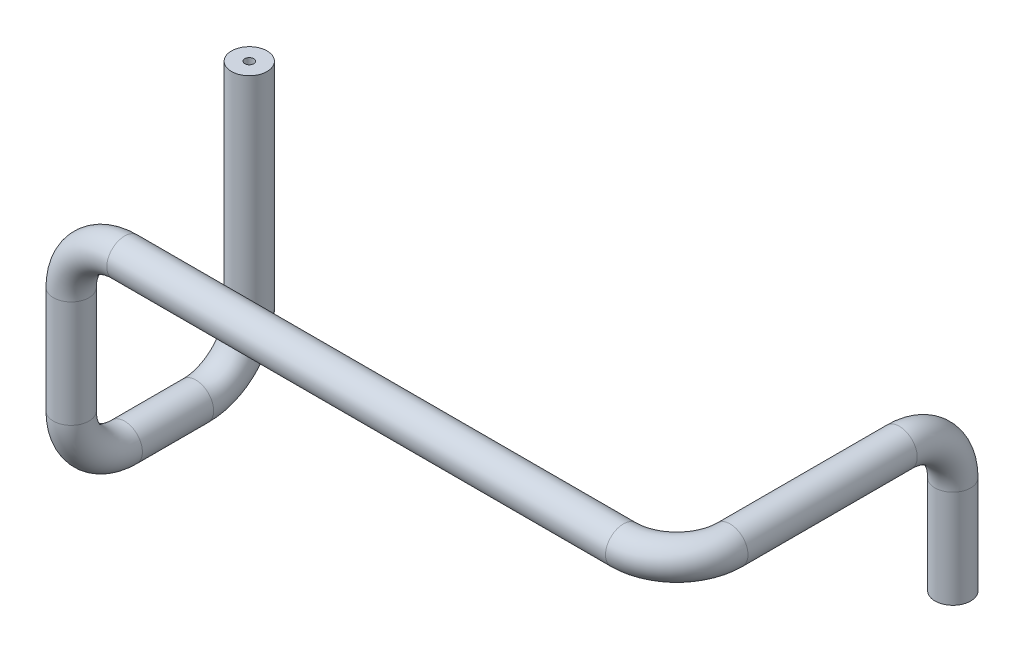
ISO-10303-21;
HEADER;
FILE_DESCRIPTION(('STEP AP214'),'2;1');
FILE_NAME('part.step','',(''),(''),'','','');
FILE_SCHEMA(('AUTOMOTIVE_DESIGN { 1 0 10303 214 1 1 1 1 }'));
ENDSEC;
DATA;
#1=APPLICATION_CONTEXT('core data for automotive mechanical design processes');
#2=APPLICATION_PROTOCOL_DEFINITION('international standard','automotive_design',2000,#1);
#3=PRODUCT_CONTEXT('',#1,'mechanical');
#4=PRODUCT('Part','Part','',(#3));
#5=PRODUCT_RELATED_PRODUCT_CATEGORY('part','',(#4));
#6=PRODUCT_DEFINITION_FORMATION('','',#4);
#7=PRODUCT_DEFINITION_CONTEXT('part definition',#1,'design');
#8=PRODUCT_DEFINITION('design','',#6,#7);
#9=PRODUCT_DEFINITION_SHAPE('','',#8);
#10=(LENGTH_UNIT() NAMED_UNIT(*) SI_UNIT(.MILLI.,.METRE.));
#11=(NAMED_UNIT(*) PLANE_ANGLE_UNIT() SI_UNIT($,.RADIAN.));
#12=(NAMED_UNIT(*) SI_UNIT($,.STERADIAN.) SOLID_ANGLE_UNIT());
#13=UNCERTAINTY_MEASURE_WITH_UNIT(LENGTH_MEASURE(1.E-05),#10,'distance_accuracy_value','');
#14=(GEOMETRIC_REPRESENTATION_CONTEXT(3) GLOBAL_UNCERTAINTY_ASSIGNED_CONTEXT((#13)) GLOBAL_UNIT_ASSIGNED_CONTEXT((#10,
#11,#12)) REPRESENTATION_CONTEXT('',''));
#15=CARTESIAN_POINT('',(0.,0.,0.));
#16=DIRECTION('',(0.,0.,1.));
#17=DIRECTION('',(1.,0.,0.));
#18=AXIS2_PLACEMENT_3D('',#15,#16,#17);
#19=CARTESIAN_POINT('',(60.,402.,236.));
#20=DIRECTION('',(0.,1.,0.));
#21=DIRECTION('',(1.,0.,0.));
#22=AXIS2_PLACEMENT_3D('',#19,#20,#21);
#23=PLANE('',#22);
#24=CARTESIAN_POINT('',(60.,402.,236.));
#25=DIRECTION('',(0.,1.,0.));
#26=DIRECTION('',(1.,0.,0.));
#27=AXIS2_PLACEMENT_3D('',#24,#25,#26);
#28=CIRCLE('',#27,0.5);
#29=CARTESIAN_POINT('',(60.5,402.,236.));
#30=VERTEX_POINT('',#29);
#31=EDGE_CURVE('E361',#30,#30,#28,.T.);
#32=ORIENTED_EDGE('',*,*,#31,.F.);
#33=EDGE_LOOP('',(#32));
#34=FACE_BOUND('',#33,.T.);
#35=CARTESIAN_POINT('',(60.,402.,236.));
#36=DIRECTION('',(0.,1.,0.));
#37=DIRECTION('',(0.,0.,1.));
#38=AXIS2_PLACEMENT_3D('',#35,#36,#37);
#39=CIRCLE('',#38,2.);
#40=CARTESIAN_POINT('',(60.,402.,238.));
#41=VERTEX_POINT('',#40);
#42=EDGE_CURVE('E75',#41,#41,#39,.T.);
#43=ORIENTED_EDGE('',*,*,#42,.T.);
#44=EDGE_LOOP('',(#43));
#45=FACE_BOUND('',#44,.T.);
#46=ADVANCED_FACE('F52',(#34,#45),#23,.T.);
#47=CARTESIAN_POINT('',(128.,379.,225.));
#48=DIRECTION('',(0.,1.,0.));
#49=DIRECTION('',(0.,0.,1.));
#50=AXIS2_PLACEMENT_3D('',#47,#48,#49);
#51=PLANE('',#50);
#52=CARTESIAN_POINT('',(128.,379.,225.));
#53=DIRECTION('',(0.,1.,0.));
#54=DIRECTION('',(0.,0.,1.));
#55=AXIS2_PLACEMENT_3D('',#52,#53,#54);
#56=CIRCLE('',#55,0.5);
#57=CARTESIAN_POINT('',(128.,379.,225.5));
#58=VERTEX_POINT('',#57);
#59=EDGE_CURVE('E73',#58,#58,#56,.T.);
#60=ORIENTED_EDGE('',*,*,#59,.T.);
#61=EDGE_LOOP('',(#60));
#62=FACE_BOUND('',#61,.T.);
#63=CARTESIAN_POINT('',(128.,379.,225.));
#64=DIRECTION('',(0.,1.,0.));
#65=DIRECTION('',(0.,0.,1.));
#66=AXIS2_PLACEMENT_3D('',#63,#64,#65);
#67=CIRCLE('',#66,2.);
#68=CARTESIAN_POINT('',(128.,379.,227.));
#69=VERTEX_POINT('',#68);
#70=EDGE_CURVE('E11',#69,#69,#67,.T.);
#71=ORIENTED_EDGE('',*,*,#70,.F.);
#72=EDGE_LOOP('',(#71));
#73=FACE_BOUND('',#72,.T.);
#74=ADVANCED_FACE('F180',(#62,#73),#51,.F.);
#75=CARTESIAN_POINT('',(60.,402.,236.));
#76=DIRECTION('',(0.,-1.,0.));
#77=DIRECTION('',(0.,0.,-1.));
#78=AXIS2_PLACEMENT_3D('',#75,#76,#77);
#79=CYLINDRICAL_SURFACE('',#78,2.);
#80=CARTESIAN_POINT('',(60.,378.,236.));
#81=DIRECTION('',(0.,-1.,0.));
#82=DIRECTION('',(0.,0.,-1.));
#83=AXIS2_PLACEMENT_3D('',#80,#81,#82);
#84=CIRCLE('',#83,2.);
#85=CARTESIAN_POINT('',(60.,378.,234.));
#86=VERTEX_POINT('',#85);
#87=EDGE_CURVE('E74',#86,#86,#84,.F.);
#88=ORIENTED_EDGE('',*,*,#87,.T.);
#89=EDGE_LOOP('',(#88));
#90=FACE_BOUND('',#89,.T.);
#91=ORIENTED_EDGE('',*,*,#42,.F.);
#92=EDGE_LOOP('',(#91));
#93=FACE_BOUND('',#92,.T.);
#94=ADVANCED_FACE('F179',(#90,#93),#79,.T.);
#95=CARTESIAN_POINT('',(60.,378.,242.));
#96=DIRECTION('',(-1.,0.,0.));
#97=DIRECTION('',(0.,0.,1.));
#98=AXIS2_PLACEMENT_3D('',#95,#96,#97);
#99=TOROIDAL_SURFACE('',#98,5.99999999999998,2.);
#100=CARTESIAN_POINT('',(60.,372.,242.));
#101=DIRECTION('',(0.,0.,-1.));
#102=DIRECTION('',(0.,1.,0.));
#103=AXIS2_PLACEMENT_3D('',#100,#101,#102);
#104=CIRCLE('',#103,2.);
#105=CARTESIAN_POINT('',(60.,370.,242.));
#106=VERTEX_POINT('',#105);
#107=EDGE_CURVE('E78',#106,#106,#104,.T.);
#108=CARTESIAN_POINT('',(60.,378.,242.));
#109=DIRECTION('',(-1.,0.,0.));
#110=DIRECTION('',(0.,0.,1.));
#111=AXIS2_PLACEMENT_3D('',#108,#109,#110);
#112=CIRCLE('',#111,7.99999999999998);
#113=EDGE_CURVE('',#86,#106,#112,.T.);
#114=ORIENTED_EDGE('',*,*,#87,.F.);
#115=ORIENTED_EDGE('',*,*,#107,.T.);
#116=ORIENTED_EDGE('',*,*,#113,.T.);
#117=ORIENTED_EDGE('',*,*,#113,.F.);
#118=EDGE_LOOP('',(#114,#116,#115,#117));
#119=FACE_BOUND('',#118,.T.);
#120=ADVANCED_FACE('F189',(#119),#99,.T.);
#121=CARTESIAN_POINT('',(60.,372.,242.));
#122=DIRECTION('',(0.,0.,1.));
#123=DIRECTION('',(1.,0.,0.));
#124=AXIS2_PLACEMENT_3D('',#121,#122,#123);
#125=CYLINDRICAL_SURFACE('',#124,2.);
#126=CARTESIAN_POINT('',(60.,372.,250.));
#127=DIRECTION('',(0.,0.,1.));
#128=DIRECTION('',(1.,0.,0.));
#129=AXIS2_PLACEMENT_3D('',#126,#127,#128);
#130=CIRCLE('',#129,2.);
#131=CARTESIAN_POINT('',(60.,370.,250.));
#132=VERTEX_POINT('',#131);
#133=EDGE_CURVE('E91',#132,#132,#130,.F.);
#134=ORIENTED_EDGE('',*,*,#133,.T.);
#135=EDGE_LOOP('',(#134));
#136=FACE_BOUND('',#135,.T.);
#137=ORIENTED_EDGE('',*,*,#107,.F.);
#138=EDGE_LOOP('',(#137));
#139=FACE_BOUND('',#138,.T.);
#140=ADVANCED_FACE('F187',(#136,#139),#125,.T.);
#141=CARTESIAN_POINT('',(60.,378.,250.));
#142=DIRECTION('',(-1.,0.,0.));
#143=DIRECTION('',(0.,0.,1.));
#144=AXIS2_PLACEMENT_3D('',#141,#142,#143);
#145=TOROIDAL_SURFACE('',#144,5.99999999999995,2.);
#146=CARTESIAN_POINT('',(60.,378.,256.));
#147=DIRECTION('',(0.,-1.,0.));
#148=DIRECTION('',(0.,0.,-1.));
#149=AXIS2_PLACEMENT_3D('',#146,#147,#148);
#150=CIRCLE('',#149,2.);
#151=CARTESIAN_POINT('',(60.,378.,258.));
#152=VERTEX_POINT('',#151);
#153=EDGE_CURVE('E96',#152,#152,#150,.T.);
#154=CARTESIAN_POINT('',(60.,378.,250.));
#155=DIRECTION('',(-1.,0.,0.));
#156=DIRECTION('',(0.,0.,1.));
#157=AXIS2_PLACEMENT_3D('',#154,#155,#156);
#158=CIRCLE('',#157,7.99999999999995);
#159=EDGE_CURVE('',#132,#152,#158,.T.);
#160=ORIENTED_EDGE('',*,*,#133,.F.);
#161=ORIENTED_EDGE('',*,*,#153,.T.);
#162=ORIENTED_EDGE('',*,*,#159,.T.);
#163=ORIENTED_EDGE('',*,*,#159,.F.);
#164=EDGE_LOOP('',(#160,#162,#161,#163));
#165=FACE_BOUND('',#164,.T.);
#166=ADVANCED_FACE('F193',(#165),#145,.T.);
#167=CARTESIAN_POINT('',(60.,378.,256.));
#168=DIRECTION('',(0.,1.,0.));
#169=DIRECTION('',(-1.,0.,0.));
#170=AXIS2_PLACEMENT_3D('',#167,#168,#169);
#171=CYLINDRICAL_SURFACE('',#170,2.);
#172=CARTESIAN_POINT('',(60.,390.,256.));
#173=DIRECTION('',(0.,1.,0.));
#174=DIRECTION('',(-1.,0.,0.));
#175=AXIS2_PLACEMENT_3D('',#172,#173,#174);
#176=CIRCLE('',#175,2.);
#177=CARTESIAN_POINT('',(58.,390.,256.));
#178=VERTEX_POINT('',#177);
#179=EDGE_CURVE('E97',#178,#178,#176,.F.);
#180=ORIENTED_EDGE('',*,*,#179,.T.);
#181=EDGE_LOOP('',(#180));
#182=FACE_BOUND('',#181,.T.);
#183=ORIENTED_EDGE('',*,*,#153,.F.);
#184=EDGE_LOOP('',(#183));
#185=FACE_BOUND('',#184,.T.);
#186=ADVANCED_FACE('F196',(#182,#185),#171,.T.);
#187=CARTESIAN_POINT('',(66.,390.,256.));
#188=DIRECTION('',(0.,0.,-1.));
#189=DIRECTION('',(-1.,0.,0.));
#190=AXIS2_PLACEMENT_3D('',#187,#188,#189);
#191=TOROIDAL_SURFACE('',#190,6.00000000000001,2.);
#192=CARTESIAN_POINT('',(66.,396.,256.));
#193=DIRECTION('',(-1.,0.,0.));
#194=DIRECTION('',(0.,-1.,0.));
#195=AXIS2_PLACEMENT_3D('',#192,#193,#194);
#196=CIRCLE('',#195,2.);
#197=CARTESIAN_POINT('',(66.,398.,256.));
#198=VERTEX_POINT('',#197);
#199=EDGE_CURVE('E105',#198,#198,#196,.T.);
#200=CARTESIAN_POINT('',(66.,390.,256.));
#201=DIRECTION('',(0.,0.,-1.));
#202=DIRECTION('',(-1.,0.,0.));
#203=AXIS2_PLACEMENT_3D('',#200,#201,#202);
#204=CIRCLE('',#203,8.00000000000001);
#205=EDGE_CURVE('',#178,#198,#204,.T.);
#206=ORIENTED_EDGE('',*,*,#179,.F.);
#207=ORIENTED_EDGE('',*,*,#199,.T.);
#208=ORIENTED_EDGE('',*,*,#205,.T.);
#209=ORIENTED_EDGE('',*,*,#205,.F.);
#210=EDGE_LOOP('',(#206,#208,#207,#209));
#211=FACE_BOUND('',#210,.T.);
#212=ADVANCED_FACE('F205',(#211),#191,.T.);
#213=CARTESIAN_POINT('',(66.,396.,256.));
#214=DIRECTION('',(1.,0.,0.));
#215=DIRECTION('',(0.,0.,-1.));
#216=AXIS2_PLACEMENT_3D('',#213,#214,#215);
#217=CYLINDRICAL_SURFACE('',#216,2.);
#218=CARTESIAN_POINT('',(122.,396.,256.));
#219=DIRECTION('',(1.,0.,0.));
#220=DIRECTION('',(0.,0.,-1.));
#221=AXIS2_PLACEMENT_3D('',#218,#219,#220);
#222=CIRCLE('',#221,2.);
#223=CARTESIAN_POINT('',(122.,396.,258.));
#224=VERTEX_POINT('',#223);
#225=EDGE_CURVE('E104',#224,#224,#222,.F.);
#226=ORIENTED_EDGE('',*,*,#225,.T.);
#227=EDGE_LOOP('',(#226));
#228=FACE_BOUND('',#227,.T.);
#229=ORIENTED_EDGE('',*,*,#199,.F.);
#230=EDGE_LOOP('',(#229));
#231=FACE_BOUND('',#230,.T.);
#232=ADVANCED_FACE('F125',(#228,#231),#217,.T.);
#233=CARTESIAN_POINT('',(122.,396.,250.));
#234=DIRECTION('',(0.,1.,0.));
#235=DIRECTION('',(0.,0.,1.));
#236=AXIS2_PLACEMENT_3D('',#233,#234,#235);
#237=TOROIDAL_SURFACE('',#236,6.00000000000001,2.);
#238=CARTESIAN_POINT('',(128.,396.,250.));
#239=DIRECTION('',(0.,0.,1.));
#240=DIRECTION('',(1.,0.,0.));
#241=AXIS2_PLACEMENT_3D('',#238,#239,#240);
#242=CIRCLE('',#241,2.);
#243=CARTESIAN_POINT('',(130.,396.,250.));
#244=VERTEX_POINT('',#243);
#245=EDGE_CURVE('E68',#244,#244,#242,.T.);
#246=CARTESIAN_POINT('',(122.,396.,250.));
#247=DIRECTION('',(0.,1.,0.));
#248=DIRECTION('',(0.,0.,1.));
#249=AXIS2_PLACEMENT_3D('',#246,#247,#248);
#250=CIRCLE('',#249,8.00000000000001);
#251=EDGE_CURVE('',#224,#244,#250,.T.);
#252=ORIENTED_EDGE('',*,*,#225,.F.);
#253=ORIENTED_EDGE('',*,*,#245,.T.);
#254=ORIENTED_EDGE('',*,*,#251,.T.);
#255=ORIENTED_EDGE('',*,*,#251,.F.);
#256=EDGE_LOOP('',(#252,#254,#253,#255));
#257=FACE_BOUND('',#256,.T.);
#258=ADVANCED_FACE('F109',(#257),#237,.T.);
#259=CARTESIAN_POINT('',(128.,396.,250.));
#260=DIRECTION('',(0.,0.,-1.));
#261=DIRECTION('',(-1.,0.,0.));
#262=AXIS2_PLACEMENT_3D('',#259,#260,#261);
#263=CYLINDRICAL_SURFACE('',#262,2.);
#264=CARTESIAN_POINT('',(128.,396.,231.));
#265=DIRECTION('',(0.,0.,-1.));
#266=DIRECTION('',(-1.,0.,0.));
#267=AXIS2_PLACEMENT_3D('',#264,#265,#266);
#268=CIRCLE('',#267,2.);
#269=CARTESIAN_POINT('',(128.,398.,231.));
#270=VERTEX_POINT('',#269);
#271=EDGE_CURVE('E63',#270,#270,#268,.F.);
#272=ORIENTED_EDGE('',*,*,#271,.T.);
#273=EDGE_LOOP('',(#272));
#274=FACE_BOUND('',#273,.T.);
#275=ORIENTED_EDGE('',*,*,#245,.F.);
#276=EDGE_LOOP('',(#275));
#277=FACE_BOUND('',#276,.T.);
#278=ADVANCED_FACE('F114',(#274,#277),#263,.T.);
#279=CARTESIAN_POINT('',(128.,390.,231.));
#280=DIRECTION('',(-1.,0.,0.));
#281=DIRECTION('',(0.,0.,1.));
#282=AXIS2_PLACEMENT_3D('',#279,#280,#281);
#283=TOROIDAL_SURFACE('',#282,5.99999999999995,2.);
#284=CARTESIAN_POINT('',(128.,390.000000000002,225.));
#285=DIRECTION('',(0.,1.,3.2430758787046E-13));
#286=DIRECTION('',(0.,-3.2430758787046E-13,1.));
#287=AXIS2_PLACEMENT_3D('',#284,#285,#286);
#288=CIRCLE('',#287,2.);
#289=CARTESIAN_POINT('',(128.,390.000000000003,223.));
#290=VERTEX_POINT('',#289);
#291=EDGE_CURVE('E58',#290,#290,#288,.T.);
#292=CARTESIAN_POINT('',(128.,390.,231.));
#293=DIRECTION('',(-1.,0.,0.));
#294=DIRECTION('',(0.,0.,1.));
#295=AXIS2_PLACEMENT_3D('',#292,#293,#294);
#296=CIRCLE('',#295,7.99999999999995);
#297=EDGE_CURVE('',#270,#290,#296,.T.);
#298=ORIENTED_EDGE('',*,*,#271,.F.);
#299=ORIENTED_EDGE('',*,*,#291,.T.);
#300=ORIENTED_EDGE('',*,*,#297,.T.);
#301=ORIENTED_EDGE('',*,*,#297,.F.);
#302=EDGE_LOOP('',(#298,#300,#299,#301));
#303=FACE_BOUND('',#302,.T.);
#304=ADVANCED_FACE('F113',(#303),#283,.T.);
#305=CARTESIAN_POINT('',(128.,390.,225.));
#306=DIRECTION('',(0.,-1.,0.));
#307=DIRECTION('',(0.,0.,-1.));
#308=AXIS2_PLACEMENT_3D('',#305,#306,#307);
#309=CYLINDRICAL_SURFACE('',#308,2.);
#310=ORIENTED_EDGE('',*,*,#70,.T.);
#311=EDGE_LOOP('',(#310));
#312=FACE_BOUND('',#311,.T.);
#313=ORIENTED_EDGE('',*,*,#291,.F.);
#314=EDGE_LOOP('',(#313));
#315=FACE_BOUND('',#314,.T.);
#316=ADVANCED_FACE('F54',(#312,#315),#309,.T.);
#317=CARTESIAN_POINT('',(60.,402.,236.));
#318=DIRECTION('',(0.,-1.,0.));
#319=DIRECTION('',(0.,0.,-1.));
#320=AXIS2_PLACEMENT_3D('',#317,#318,#319);
#321=CYLINDRICAL_SURFACE('',#320,0.5);
#322=CARTESIAN_POINT('',(60.,378.,236.));
#323=DIRECTION('',(0.,1.,0.));
#324=DIRECTION('',(1.,0.,0.));
#325=AXIS2_PLACEMENT_3D('',#322,#323,#324);
#326=CIRCLE('',#325,0.5);
#327=CARTESIAN_POINT('',(60.,378.,235.5));
#328=VERTEX_POINT('',#327);
#329=EDGE_CURVE('E365',#328,#328,#326,.T.);
#330=ORIENTED_EDGE('',*,*,#329,.F.);
#331=EDGE_LOOP('',(#330));
#332=FACE_BOUND('',#331,.T.);
#333=ORIENTED_EDGE('',*,*,#31,.T.);
#334=EDGE_LOOP('',(#333));
#335=FACE_BOUND('',#334,.T.);
#336=ADVANCED_FACE('F124',(#332,#335),#321,.F.);
#337=CARTESIAN_POINT('',(60.,378.,242.));
#338=DIRECTION('',(-1.,0.,0.));
#339=DIRECTION('',(0.,0.,1.));
#340=AXIS2_PLACEMENT_3D('',#337,#338,#339);
#341=TOROIDAL_SURFACE('',#340,5.99999999999998,0.5);
#342=CARTESIAN_POINT('',(60.,372.,242.));
#343=DIRECTION('',(0.,0.,-1.));
#344=DIRECTION('',(1.,0.,0.));
#345=AXIS2_PLACEMENT_3D('',#342,#343,#344);
#346=CIRCLE('',#345,0.5);
#347=CARTESIAN_POINT('',(60.,371.5,242.));
#348=VERTEX_POINT('',#347);
#349=EDGE_CURVE('E370',#348,#348,#346,.T.);
#350=CARTESIAN_POINT('',(60.,378.,242.));
#351=DIRECTION('',(-1.,0.,0.));
#352=DIRECTION('',(0.,0.,1.));
#353=AXIS2_PLACEMENT_3D('',#350,#351,#352);
#354=CIRCLE('',#353,6.49999999999998);
#355=EDGE_CURVE('',#328,#348,#354,.T.);
#356=ORIENTED_EDGE('',*,*,#329,.T.);
#357=ORIENTED_EDGE('',*,*,#349,.F.);
#358=ORIENTED_EDGE('',*,*,#355,.T.);
#359=ORIENTED_EDGE('',*,*,#355,.F.);
#360=EDGE_LOOP('',(#356,#358,#357,#359));
#361=FACE_BOUND('',#360,.T.);
#362=ADVANCED_FACE('F129',(#361),#341,.F.);
#363=CARTESIAN_POINT('',(60.,372.,242.));
#364=DIRECTION('',(0.,0.,1.));
#365=DIRECTION('',(1.,0.,0.));
#366=AXIS2_PLACEMENT_3D('',#363,#364,#365);
#367=CYLINDRICAL_SURFACE('',#366,0.5);
#368=CARTESIAN_POINT('',(60.,372.,250.));
#369=DIRECTION('',(0.,0.,-1.));
#370=DIRECTION('',(1.,0.,0.));
#371=AXIS2_PLACEMENT_3D('',#368,#369,#370);
#372=CIRCLE('',#371,0.5);
#373=CARTESIAN_POINT('',(60.,371.5,250.));
#374=VERTEX_POINT('',#373);
#375=EDGE_CURVE('E375',#374,#374,#372,.T.);
#376=ORIENTED_EDGE('',*,*,#375,.F.);
#377=EDGE_LOOP('',(#376));
#378=FACE_BOUND('',#377,.T.);
#379=ORIENTED_EDGE('',*,*,#349,.T.);
#380=EDGE_LOOP('',(#379));
#381=FACE_BOUND('',#380,.T.);
#382=ADVANCED_FACE('F136',(#378,#381),#367,.F.);
#383=CARTESIAN_POINT('',(60.,378.,250.));
#384=DIRECTION('',(-1.,0.,0.));
#385=DIRECTION('',(0.,0.,1.));
#386=AXIS2_PLACEMENT_3D('',#383,#384,#385);
#387=TOROIDAL_SURFACE('',#386,5.99999999999995,0.5);
#388=CARTESIAN_POINT('',(60.,378.,256.));
#389=DIRECTION('',(0.,-1.,0.));
#390=DIRECTION('',(1.,0.,0.));
#391=AXIS2_PLACEMENT_3D('',#388,#389,#390);
#392=CIRCLE('',#391,0.5);
#393=CARTESIAN_POINT('',(60.,378.,256.5));
#394=VERTEX_POINT('',#393);
#395=EDGE_CURVE('E374',#394,#394,#392,.T.);
#396=CARTESIAN_POINT('',(60.,378.,250.));
#397=DIRECTION('',(-1.,0.,0.));
#398=DIRECTION('',(0.,0.,1.));
#399=AXIS2_PLACEMENT_3D('',#396,#397,#398);
#400=CIRCLE('',#399,6.49999999999995);
#401=EDGE_CURVE('',#374,#394,#400,.T.);
#402=ORIENTED_EDGE('',*,*,#375,.T.);
#403=ORIENTED_EDGE('',*,*,#395,.F.);
#404=ORIENTED_EDGE('',*,*,#401,.T.);
#405=ORIENTED_EDGE('',*,*,#401,.F.);
#406=EDGE_LOOP('',(#402,#404,#403,#405));
#407=FACE_BOUND('',#406,.T.);
#408=ADVANCED_FACE('F145',(#407),#387,.F.);
#409=CARTESIAN_POINT('',(60.,378.,256.));
#410=DIRECTION('',(0.,1.,0.));
#411=DIRECTION('',(-1.,0.,0.));
#412=AXIS2_PLACEMENT_3D('',#409,#410,#411);
#413=CYLINDRICAL_SURFACE('',#412,0.5);
#414=CARTESIAN_POINT('',(60.,390.,256.));
#415=DIRECTION('',(0.,-1.,0.));
#416=DIRECTION('',(1.,0.,0.));
#417=AXIS2_PLACEMENT_3D('',#414,#415,#416);
#418=CIRCLE('',#417,0.5);
#419=CARTESIAN_POINT('',(59.5,390.,256.));
#420=VERTEX_POINT('',#419);
#421=EDGE_CURVE('E378',#420,#420,#418,.T.);
#422=ORIENTED_EDGE('',*,*,#421,.F.);
#423=EDGE_LOOP('',(#422));
#424=FACE_BOUND('',#423,.T.);
#425=ORIENTED_EDGE('',*,*,#395,.T.);
#426=EDGE_LOOP('',(#425));
#427=FACE_BOUND('',#426,.T.);
#428=ADVANCED_FACE('F146',(#424,#427),#413,.F.);
#429=CARTESIAN_POINT('',(66.,390.,256.));
#430=DIRECTION('',(0.,0.,-1.));
#431=DIRECTION('',(-1.,0.,0.));
#432=AXIS2_PLACEMENT_3D('',#429,#430,#431);
#433=TOROIDAL_SURFACE('',#432,6.00000000000001,0.5);
#434=CARTESIAN_POINT('',(66.,396.,256.));
#435=DIRECTION('',(-1.,0.,0.));
#436=DIRECTION('',(0.,-1.,0.));
#437=AXIS2_PLACEMENT_3D('',#434,#435,#436);
#438=CIRCLE('',#437,0.5);
#439=CARTESIAN_POINT('',(66.,396.5,256.));
#440=VERTEX_POINT('',#439);
#441=EDGE_CURVE('E381',#440,#440,#438,.T.);
#442=CARTESIAN_POINT('',(66.,390.,256.));
#443=DIRECTION('',(0.,0.,-1.));
#444=DIRECTION('',(-1.,0.,0.));
#445=AXIS2_PLACEMENT_3D('',#442,#443,#444);
#446=CIRCLE('',#445,6.50000000000001);
#447=EDGE_CURVE('',#420,#440,#446,.T.);
#448=ORIENTED_EDGE('',*,*,#421,.T.);
#449=ORIENTED_EDGE('',*,*,#441,.F.);
#450=ORIENTED_EDGE('',*,*,#447,.T.);
#451=ORIENTED_EDGE('',*,*,#447,.F.);
#452=EDGE_LOOP('',(#448,#450,#449,#451));
#453=FACE_BOUND('',#452,.T.);
#454=ADVANCED_FACE('F155',(#453),#433,.F.);
#455=CARTESIAN_POINT('',(66.,396.,256.));
#456=DIRECTION('',(1.,0.,0.));
#457=DIRECTION('',(0.,0.,-1.));
#458=AXIS2_PLACEMENT_3D('',#455,#456,#457);
#459=CYLINDRICAL_SURFACE('',#458,0.5);
#460=CARTESIAN_POINT('',(122.,396.,256.));
#461=DIRECTION('',(-1.,0.,0.));
#462=DIRECTION('',(0.,-1.,0.));
#463=AXIS2_PLACEMENT_3D('',#460,#461,#462);
#464=CIRCLE('',#463,0.5);
#465=CARTESIAN_POINT('',(122.,396.,256.5));
#466=VERTEX_POINT('',#465);
#467=EDGE_CURVE('E383',#466,#466,#464,.T.);
#468=ORIENTED_EDGE('',*,*,#467,.F.);
#469=EDGE_LOOP('',(#468));
#470=FACE_BOUND('',#469,.T.);
#471=ORIENTED_EDGE('',*,*,#441,.T.);
#472=EDGE_LOOP('',(#471));
#473=FACE_BOUND('',#472,.T.);
#474=ADVANCED_FACE('F156',(#470,#473),#459,.F.);
#475=CARTESIAN_POINT('',(122.,396.,250.));
#476=DIRECTION('',(0.,1.,0.));
#477=DIRECTION('',(0.,0.,1.));
#478=AXIS2_PLACEMENT_3D('',#475,#476,#477);
#479=TOROIDAL_SURFACE('',#478,6.00000000000001,0.5);
#480=CARTESIAN_POINT('',(128.,396.,250.));
#481=DIRECTION('',(0.,0.,1.));
#482=DIRECTION('',(0.,-1.,0.));
#483=AXIS2_PLACEMENT_3D('',#480,#481,#482);
#484=CIRCLE('',#483,0.5);
#485=CARTESIAN_POINT('',(128.5,396.,250.));
#486=VERTEX_POINT('',#485);
#487=EDGE_CURVE('E390',#486,#486,#484,.T.);
#488=CARTESIAN_POINT('',(122.,396.,250.));
#489=DIRECTION('',(0.,1.,0.));
#490=DIRECTION('',(0.,0.,1.));
#491=AXIS2_PLACEMENT_3D('',#488,#489,#490);
#492=CIRCLE('',#491,6.50000000000001);
#493=EDGE_CURVE('',#466,#486,#492,.T.);
#494=ORIENTED_EDGE('',*,*,#467,.T.);
#495=ORIENTED_EDGE('',*,*,#487,.F.);
#496=ORIENTED_EDGE('',*,*,#493,.T.);
#497=ORIENTED_EDGE('',*,*,#493,.F.);
#498=EDGE_LOOP('',(#494,#496,#495,#497));
#499=FACE_BOUND('',#498,.T.);
#500=ADVANCED_FACE('F159',(#499),#479,.F.);
#501=CARTESIAN_POINT('',(128.,396.,250.));
#502=DIRECTION('',(0.,0.,-1.));
#503=DIRECTION('',(-1.,0.,0.));
#504=AXIS2_PLACEMENT_3D('',#501,#502,#503);
#505=CYLINDRICAL_SURFACE('',#504,0.5);
#506=CARTESIAN_POINT('',(128.,396.,231.));
#507=DIRECTION('',(0.,0.,1.));
#508=DIRECTION('',(0.,-1.,0.));
#509=AXIS2_PLACEMENT_3D('',#506,#507,#508);
#510=CIRCLE('',#509,0.5);
#511=CARTESIAN_POINT('',(128.,396.5,231.));
#512=VERTEX_POINT('',#511);
#513=EDGE_CURVE('E87',#512,#512,#510,.T.);
#514=ORIENTED_EDGE('',*,*,#513,.F.);
#515=EDGE_LOOP('',(#514));
#516=FACE_BOUND('',#515,.T.);
#517=ORIENTED_EDGE('',*,*,#487,.T.);
#518=EDGE_LOOP('',(#517));
#519=FACE_BOUND('',#518,.T.);
#520=ADVANCED_FACE('F163',(#516,#519),#505,.F.);
#521=CARTESIAN_POINT('',(128.,390.,231.));
#522=DIRECTION('',(-1.,0.,0.));
#523=DIRECTION('',(0.,0.,1.));
#524=AXIS2_PLACEMENT_3D('',#521,#522,#523);
#525=TOROIDAL_SURFACE('',#524,5.99999999999995,0.5);
#526=CARTESIAN_POINT('',(128.,390.000000000002,224.999999999997));
#527=DIRECTION('',(0.,1.,0.));
#528=DIRECTION('',(0.,0.,1.));
#529=AXIS2_PLACEMENT_3D('',#526,#527,#528);
#530=CIRCLE('',#529,0.5);
#531=CARTESIAN_POINT('',(128.,390.000000000002,224.5));
#532=VERTEX_POINT('',#531);
#533=EDGE_CURVE('E85',#532,#532,#530,.T.);
#534=CARTESIAN_POINT('',(128.,390.,231.));
#535=DIRECTION('',(-1.,0.,0.));
#536=DIRECTION('',(0.,0.,1.));
#537=AXIS2_PLACEMENT_3D('',#534,#535,#536);
#538=CIRCLE('',#537,6.49999999999995);
#539=EDGE_CURVE('',#512,#532,#538,.T.);
#540=ORIENTED_EDGE('',*,*,#513,.T.);
#541=ORIENTED_EDGE('',*,*,#533,.F.);
#542=ORIENTED_EDGE('',*,*,#539,.T.);
#543=ORIENTED_EDGE('',*,*,#539,.F.);
#544=EDGE_LOOP('',(#540,#542,#541,#543));
#545=FACE_BOUND('',#544,.T.);
#546=ADVANCED_FACE('F169',(#545),#525,.F.);
#547=CARTESIAN_POINT('',(128.,390.,225.));
#548=DIRECTION('',(0.,-1.,0.));
#549=DIRECTION('',(0.,0.,-1.));
#550=AXIS2_PLACEMENT_3D('',#547,#548,#549);
#551=CYLINDRICAL_SURFACE('',#550,0.5);
#552=ORIENTED_EDGE('',*,*,#59,.F.);
#553=EDGE_LOOP('',(#552));
#554=FACE_BOUND('',#553,.T.);
#555=ORIENTED_EDGE('',*,*,#533,.T.);
#556=EDGE_LOOP('',(#555));
#557=FACE_BOUND('',#556,.T.);
#558=ADVANCED_FACE('F171',(#554,#557),#551,.F.);
#559=CLOSED_SHELL('',(#46,#74,#94,#120,#140,#166,#186,#212,#232,#258,#278,#304,#316,#336,#362,
#382,#408,#428,#454,#474,#500,#520,#546,#558));
#560=MANIFOLD_SOLID_BREP('B2',#559);
#561=ADVANCED_BREP_SHAPE_REPRESENTATION('',(#18,#560),#14);
#562=SHAPE_DEFINITION_REPRESENTATION(#9,#561);
ENDSEC;
END-ISO-10303-21;
